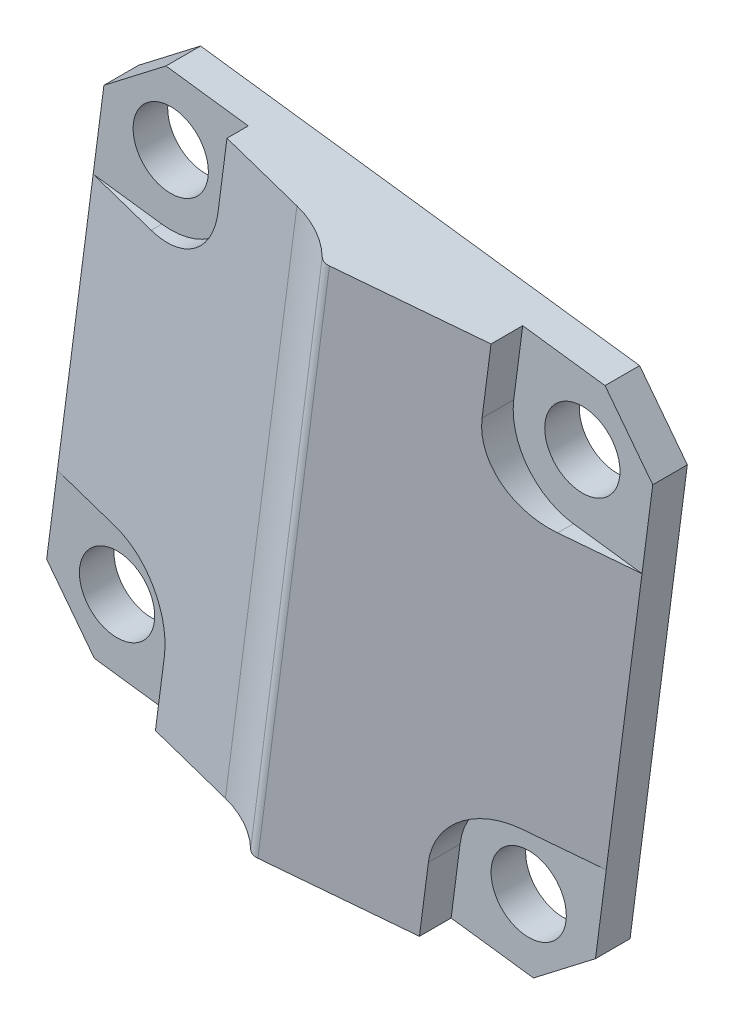
ISO-10303-21;
HEADER;
FILE_DESCRIPTION(('STEP AP214'),'2;1');
FILE_NAME('part.step','',(''),(''),'','','');
FILE_SCHEMA(('AUTOMOTIVE_DESIGN { 1 0 10303 214 1 1 1 1 }'));
ENDSEC;
DATA;
#1=APPLICATION_CONTEXT('core data for automotive mechanical design processes');
#2=APPLICATION_PROTOCOL_DEFINITION('international standard','automotive_design',2000,#1);
#3=PRODUCT_CONTEXT('',#1,'mechanical');
#4=PRODUCT('Part','Part','',(#3));
#5=PRODUCT_RELATED_PRODUCT_CATEGORY('part','',(#4));
#6=PRODUCT_DEFINITION_FORMATION('','',#4);
#7=PRODUCT_DEFINITION_CONTEXT('part definition',#1,'design');
#8=PRODUCT_DEFINITION('design','',#6,#7);
#9=PRODUCT_DEFINITION_SHAPE('','',#8);
#10=(LENGTH_UNIT() NAMED_UNIT(*) SI_UNIT(.MILLI.,.METRE.));
#11=(NAMED_UNIT(*) PLANE_ANGLE_UNIT() SI_UNIT($,.RADIAN.));
#12=(NAMED_UNIT(*) SI_UNIT($,.STERADIAN.) SOLID_ANGLE_UNIT());
#13=UNCERTAINTY_MEASURE_WITH_UNIT(LENGTH_MEASURE(1.E-05),#10,'distance_accuracy_value','');
#14=(GEOMETRIC_REPRESENTATION_CONTEXT(3) GLOBAL_UNCERTAINTY_ASSIGNED_CONTEXT((#13)) GLOBAL_UNIT_ASSIGNED_CONTEXT((#10,
#11,#12)) REPRESENTATION_CONTEXT('',''));
#15=CARTESIAN_POINT('',(0.,0.,0.));
#16=DIRECTION('',(0.,0.,1.));
#17=DIRECTION('',(1.,0.,0.));
#18=AXIS2_PLACEMENT_3D('',#15,#16,#17);
#19=CARTESIAN_POINT('',(-37.3767571490748,-111.329189903824,1.5875));
#20=DIRECTION('',(0.129314816705217,0.991603589233367,0.));
#21=DIRECTION('',(-0.991603589233367,0.129314816705217,0.));
#22=AXIS2_PLACEMENT_3D('',#19,#20,#21);
#23=PLANE('',#22);
#24=DIRECTION('',(0.991603589233367,-0.129314816705217,0.));
#25=VECTOR('',#24,1.);
#26=CARTESIAN_POINT('',(-37.3767571490748,-111.329189903824,0.));
#27=LINE('',#26,#25);
#28=CARTESIAN_POINT('',(-34.8580840324221,-111.657649538255,0.));
#29=VERTEX_POINT('',#28);
#30=CARTESIAN_POINT('',(-14.7086990992001,-114.285326613705,0.));
#31=VERTEX_POINT('',#30);
#32=EDGE_CURVE('E324',#29,#31,#27,.T.);
#33=ORIENTED_EDGE('',*,*,#32,.T.);
#34=DIRECTION('',(0.,0.,1.));
#35=VECTOR('',#34,1.);
#36=CARTESIAN_POINT('',(-14.7086990992001,-114.285326613705,1.5875));
#37=LINE('',#36,#35);
#38=CARTESIAN_POINT('',(-14.7086990992001,-114.285326613705,1.5875));
#39=VERTEX_POINT('',#38);
#40=EDGE_CURVE('E414',#31,#39,#37,.T.);
#41=ORIENTED_EDGE('',*,*,#40,.T.);
#42=DIRECTION('',(0.991603589233367,-0.129314816705217,0.));
#43=VECTOR('',#42,1.);
#44=CARTESIAN_POINT('',(-37.3767571490748,-111.329189903824,1.5875));
#45=LINE('',#44,#43);
#46=CARTESIAN_POINT('',(-18.4867087741792,-113.792637162058,1.5875));
#47=VERTEX_POINT('',#46);
#48=EDGE_CURVE('E283',#47,#39,#45,.T.);
#49=ORIENTED_EDGE('',*,*,#48,.F.);
#50=DIRECTION('',(0.,0.,-1.));
#51=VECTOR('',#50,1.);
#52=CARTESIAN_POINT('',(-18.4867087741792,-113.792637162058,1.5875));
#53=LINE('',#52,#51);
#54=CARTESIAN_POINT('',(-18.4867087741792,-113.792637162058,3.04165000000001));
#55=VERTEX_POINT('',#54);
#56=EDGE_CURVE('E292',#55,#47,#53,.T.);
#57=ORIENTED_EDGE('',*,*,#56,.F.);
#58=DIRECTION('',(-0.966583129481826,0.126051903781362,0.223221798564149));
#59=VECTOR('',#58,1.);
#60=CARTESIAN_POINT('',(-24.783391565811,-112.97148807598,4.4958));
#61=LINE('',#60,#59);
#62=CARTESIAN_POINT('',(-24.509062354858,-113.007263291012,4.43244667011057));
#63=VERTEX_POINT('',#62);
#64=EDGE_CURVE('E309',#55,#63,#61,.T.);
#65=ORIENTED_EDGE('',*,*,#64,.T.);
#66=CARTESIAN_POINT('',(-24.6215069034769,-112.992599420941,3.93726468901631));
#67=DIRECTION('',(0.129314816705217,0.991603589233367,0.));
#68=DIRECTION('',(-0.991603589233367,0.129314816705217,0.));
#69=AXIS2_PLACEMENT_3D('',#66,#67,#68);
#70=CIRCLE('',#69,0.508);
#71=CARTESIAN_POINT('',(-24.9698671790054,-112.947169830259,4.30420510750987));
#72=VERTEX_POINT('',#71);
#73=EDGE_CURVE('E348',#63,#72,#70,.F.);
#74=ORIENTED_EDGE('',*,*,#73,.T.);
#75=CARTESIAN_POINT('',(-27.931732961627,-112.560913532941,7.42404495764267));
#76=DIRECTION('',(0.129314816705217,0.991603589233367,0.));
#77=DIRECTION('',(-0.991603589233367,0.129314816705217,0.));
#78=AXIS2_PLACEMENT_3D('',#75,#76,#77);
#79=CIRCLE('',#78,4.31917162566616);
#80=CARTESIAN_POINT('',(-27.2800098672253,-112.645904605392,3.15517191458004));
#81=VERTEX_POINT('',#80);
#82=EDGE_CURVE('E307',#72,#81,#79,.T.);
#83=ORIENTED_EDGE('',*,*,#82,.T.);
#84=DIRECTION('',(-0.980055945526266,0.127808890904247,-0.152168429854696));
#85=VECTOR('',#84,1.);
#86=CARTESIAN_POINT('',(-37.3767571490748,-111.329189903824,1.5875));
#87=LINE('',#86,#85);
#88=CARTESIAN_POINT('',(-31.080074357443,-112.150338989902,2.56515473294608));
#89=VERTEX_POINT('',#88);
#90=EDGE_CURVE('E312',#81,#89,#87,.T.);
#91=ORIENTED_EDGE('',*,*,#90,.T.);
#92=DIRECTION('',(0.,0.,1.));
#93=VECTOR('',#92,1.);
#94=CARTESIAN_POINT('',(-31.080074357443,-112.150338989902,1.5875));
#95=LINE('',#94,#93);
#96=CARTESIAN_POINT('',(-31.080074357443,-112.150338989902,1.5875));
#97=VERTEX_POINT('',#96);
#98=EDGE_CURVE('E286',#97,#89,#95,.T.);
#99=ORIENTED_EDGE('',*,*,#98,.F.);
#100=DIRECTION('',(0.991603589233367,-0.129314816705217,0.));
#101=VECTOR('',#100,1.);
#102=CARTESIAN_POINT('',(-37.3767571490748,-111.329189903824,1.5875));
#103=LINE('',#102,#101);
#104=CARTESIAN_POINT('',(-34.8580840324221,-111.657649538255,1.5875));
#105=VERTEX_POINT('',#104);
#106=EDGE_CURVE('E280',#105,#97,#103,.T.);
#107=ORIENTED_EDGE('',*,*,#106,.F.);
#108=DIRECTION('',(0.,0.,-1.));
#109=VECTOR('',#108,1.);
#110=CARTESIAN_POINT('',(-34.8580840324221,-111.657649538255,1.5875));
#111=LINE('',#110,#109);
#112=EDGE_CURVE('E411',#105,#29,#111,.T.);
#113=ORIENTED_EDGE('',*,*,#112,.T.);
#114=EDGE_LOOP('',(#33,#41,#49,#57,#65,#74,#83,#91,#99,#107,#113));
#115=FACE_BOUND('',#114,.T.);
#116=ADVANCED_FACE('F35',(#115),#23,.F.);
#117=CARTESIAN_POINT('',(-34.0921608047624,-86.142458737296,1.5875));
#118=DIRECTION('',(-0.129314816705216,-0.991603589233367,0.));
#119=DIRECTION('',(0.991603589233367,-0.129314816705216,0.));
#120=AXIS2_PLACEMENT_3D('',#117,#118,#119);
#121=PLANE('',#120);
#122=DIRECTION('',(-0.991603589233367,0.129314816705216,0.));
#123=VECTOR('',#122,1.);
#124=CARTESIAN_POINT('',(-34.0921608047624,-86.142458737296,1.5875));
#125=LINE('',#124,#123);
#126=CARTESIAN_POINT('',(-11.4241027548876,-89.0985954471772,1.5875));
#127=VERTEX_POINT('',#126);
#128=CARTESIAN_POINT('',(-15.2021124298667,-88.6059059955303,1.5875));
#129=VERTEX_POINT('',#128);
#130=EDGE_CURVE('E272',#127,#129,#125,.T.);
#131=ORIENTED_EDGE('',*,*,#130,.F.);
#132=DIRECTION('',(0.,0.,-1.));
#133=VECTOR('',#132,1.);
#134=CARTESIAN_POINT('',(-11.4241027548876,-89.0985954471772,1.5875));
#135=LINE('',#134,#133);
#136=CARTESIAN_POINT('',(-11.4241027548876,-89.0985954471772,0.));
#137=VERTEX_POINT('',#136);
#138=EDGE_CURVE('E393',#127,#137,#135,.T.);
#139=ORIENTED_EDGE('',*,*,#138,.T.);
#140=DIRECTION('',(-0.991603589233367,0.129314816705216,0.));
#141=VECTOR('',#140,1.);
#142=CARTESIAN_POINT('',(-34.0921608047624,-86.142458737296,0.));
#143=LINE('',#142,#141);
#144=CARTESIAN_POINT('',(-31.5734876881096,-86.4709183717272,0.));
#145=VERTEX_POINT('',#144);
#146=EDGE_CURVE('E336',#137,#145,#143,.T.);
#147=ORIENTED_EDGE('',*,*,#146,.T.);
#148=DIRECTION('',(0.,0.,1.));
#149=VECTOR('',#148,1.);
#150=CARTESIAN_POINT('',(-31.5734876881096,-86.4709183717272,1.5875));
#151=LINE('',#150,#149);
#152=CARTESIAN_POINT('',(-31.5734876881096,-86.4709183717272,1.5875));
#153=VERTEX_POINT('',#152);
#154=EDGE_CURVE('E391',#145,#153,#151,.T.);
#155=ORIENTED_EDGE('',*,*,#154,.T.);
#156=DIRECTION('',(-0.991603589233367,0.129314816705216,0.));
#157=VECTOR('',#156,1.);
#158=CARTESIAN_POINT('',(-34.0921608047624,-86.142458737296,1.5875));
#159=LINE('',#158,#157);
#160=CARTESIAN_POINT('',(-27.7954780131305,-86.9636078233741,1.5875));
#161=VERTEX_POINT('',#160);
#162=EDGE_CURVE('E275',#161,#153,#159,.T.);
#163=ORIENTED_EDGE('',*,*,#162,.F.);
#164=DIRECTION('',(0.,0.,-1.));
#165=VECTOR('',#164,1.);
#166=CARTESIAN_POINT('',(-27.7954780131305,-86.9636078233741,1.5875));
#167=LINE('',#166,#165);
#168=CARTESIAN_POINT('',(-27.7954780131305,-86.9636078233741,2.56515473294608));
#169=VERTEX_POINT('',#168);
#170=EDGE_CURVE('E288',#169,#161,#167,.T.);
#171=ORIENTED_EDGE('',*,*,#170,.F.);
#172=DIRECTION('',(0.980055945526266,-0.127808890904246,0.152168429854696));
#173=VECTOR('',#172,1.);
#174=CARTESIAN_POINT('',(-34.0921608047623,-86.142458737296,1.5875));
#175=LINE('',#174,#173);
#176=CARTESIAN_POINT('',(-23.9954135229128,-87.4591734388641,3.15517191458004));
#177=VERTEX_POINT('',#176);
#178=EDGE_CURVE('E306',#169,#177,#175,.T.);
#179=ORIENTED_EDGE('',*,*,#178,.T.);
#180=CARTESIAN_POINT('',(-24.6471366173145,-87.3741823664132,7.42404495764267));
#181=DIRECTION('',(-0.129314816705216,-0.991603589233367,0.));
#182=DIRECTION('',(0.991603589233367,-0.129314816705216,0.));
#183=AXIS2_PLACEMENT_3D('',#180,#181,#182);
#184=CIRCLE('',#183,4.31917162566616);
#185=CARTESIAN_POINT('',(-21.6852708346929,-87.7604386637319,4.30420510750987));
#186=VERTEX_POINT('',#185);
#187=EDGE_CURVE('E314',#177,#186,#184,.T.);
#188=ORIENTED_EDGE('',*,*,#187,.T.);
#189=CARTESIAN_POINT('',(-21.3369105591644,-87.8058682544135,3.93726468901631));
#190=DIRECTION('',(-0.129314816705216,-0.991603589233367,0.));
#191=DIRECTION('',(0.991603589233367,-0.129314816705216,0.));
#192=AXIS2_PLACEMENT_3D('',#189,#190,#191);
#193=CIRCLE('',#192,0.508);
#194=CARTESIAN_POINT('',(-21.2244660105455,-87.8205321244842,4.43244667011057));
#195=VERTEX_POINT('',#194);
#196=EDGE_CURVE('E343',#186,#195,#193,.F.);
#197=ORIENTED_EDGE('',*,*,#196,.T.);
#198=DIRECTION('',(0.966583129481826,-0.126051903781361,-0.223221798564149));
#199=VECTOR('',#198,1.);
#200=CARTESIAN_POINT('',(-21.4987952214985,-87.7847569094523,4.4958));
#201=LINE('',#200,#199);
#202=CARTESIAN_POINT('',(-15.2021124298667,-88.6059059955304,3.04165));
#203=VERTEX_POINT('',#202);
#204=EDGE_CURVE('E317',#195,#203,#201,.T.);
#205=ORIENTED_EDGE('',*,*,#204,.T.);
#206=DIRECTION('',(0.,0.,1.));
#207=VECTOR('',#206,1.);
#208=CARTESIAN_POINT('',(-15.2021124298667,-88.6059059955303,1.5875));
#209=LINE('',#208,#207);
#210=EDGE_CURVE('E290',#129,#203,#209,.T.);
#211=ORIENTED_EDGE('',*,*,#210,.F.);
#212=EDGE_LOOP('',(#131,#139,#147,#155,#163,#171,#179,#188,#197,#205,#211));
#213=FACE_BOUND('',#212,.T.);
#214=ADVANCED_FACE('F443',(#213),#121,.F.);
#215=CARTESIAN_POINT('',(-28.0894487395674,-138.322783799352,4.4958));
#216=DIRECTION('',(0.221347536651338,-0.0288658859659317,0.97476767931943));
#217=DIRECTION('',(0.975174040689062,0.,-0.221439812062256));
#218=AXIS2_PLACEMENT_3D('',#215,#216,#217);
#219=PLANE('',#218);
#220=ORIENTED_EDGE('',*,*,#64,.F.);
#221=DIRECTION('',(0.129314816705219,0.991603589233367,0.));
#222=VECTOR('',#221,1.);
#223=CARTESIAN_POINT('',(-21.7927659479357,-139.14393288543,3.04165000000002));
#224=LINE('',#223,#222);
#225=CARTESIAN_POINT('',(-18.0761342311401,-110.644295766242,3.04165000000001));
#226=VERTEX_POINT('',#225);
#227=EDGE_CURVE('E388',#55,#226,#224,.T.);
#228=ORIENTED_EDGE('',*,*,#227,.T.);
#229=CARTESIAN_POINT('',(-14.9277928353242,-111.054870309281,2.31457500000001));
#230=DIRECTION('',(0.221347536651338,-0.0288658859659317,0.97476767931943));
#231=DIRECTION('',(-0.966583129481826,0.126051903781361,0.223221798564149));
#232=AXIS2_PLACEMENT_3D('',#229,#230,#231);
#233=ELLIPSE('',#232,3.2571863710302,3.17499999999998);
#234=CARTESIAN_POINT('',(-14.5172182922851,-107.906528913465,2.31457500000001));
#235=VERTEX_POINT('',#234);
#236=EDGE_CURVE('E382',#226,#235,#233,.F.);
#237=ORIENTED_EDGE('',*,*,#236,.T.);
#238=DIRECTION('',(0.966583129481826,-0.12605190378136,-0.22322179856415));
#239=VECTOR('',#238,1.);
#240=CARTESIAN_POINT('',(-23.962242479733,-106.674805284348,4.49580000000001));
#241=LINE('',#240,#239);
#242=CARTESIAN_POINT('',(-11.3688768964692,-108.317103456504,1.5875));
#243=VERTEX_POINT('',#242);
#244=EDGE_CURVE('E385',#235,#243,#241,.T.);
#245=ORIENTED_EDGE('',*,*,#244,.T.);
#246=DIRECTION('',(0.129314816705216,0.991603589233367,0.));
#247=VECTOR('',#246,1.);
#248=CARTESIAN_POINT('',(-12.1900259825473,-114.613786248136,1.5875));
#249=LINE('',#248,#247);
#250=CARTESIAN_POINT('',(-9.72657872431295,-95.7237378732403,1.5875));
#251=VERTEX_POINT('',#250);
#252=EDGE_CURVE('E328',#243,#251,#249,.T.);
#253=ORIENTED_EDGE('',*,*,#252,.T.);
#254=DIRECTION('',(-0.966583129481826,0.126051903781364,0.223221798564149));
#255=VECTOR('',#254,1.);
#256=CARTESIAN_POINT('',(-22.3199443075765,-94.0814397010841,4.49579999999997));
#257=LINE('',#256,#255);
#258=CARTESIAN_POINT('',(-12.8749201201289,-95.3131633302013,2.31457500000001));
#259=VERTEX_POINT('',#258);
#260=EDGE_CURVE('E379',#251,#259,#257,.T.);
#261=ORIENTED_EDGE('',*,*,#260,.T.);
#262=CARTESIAN_POINT('',(-12.4643455770898,-92.1648219343854,2.31457500000001));
#263=DIRECTION('',(0.221347536651338,-0.0288658859659317,0.97476767931943));
#264=DIRECTION('',(-0.966583129481826,0.126051903781361,0.223221798564149));
#265=AXIS2_PLACEMENT_3D('',#262,#263,#264);
#266=ELLIPSE('',#265,3.2571863710302,3.17499999999998);
#267=CARTESIAN_POINT('',(-15.6126869729057,-91.7542473913463,3.04165000000001));
#268=VERTEX_POINT('',#267);
#269=EDGE_CURVE('E373',#259,#268,#266,.F.);
#270=ORIENTED_EDGE('',*,*,#269,.T.);
#271=DIRECTION('',(0.129314816705218,0.991603589233367,0.));
#272=VECTOR('',#271,1.);
#273=CARTESIAN_POINT('',(-21.7927659479357,-139.14393288543,3.04165000000003));
#274=LINE('',#273,#272);
#275=EDGE_CURVE('E376',#268,#203,#274,.T.);
#276=ORIENTED_EDGE('',*,*,#275,.T.);
#277=ORIENTED_EDGE('',*,*,#204,.F.);
#278=DIRECTION('',(0.129314816705216,0.991603589233367,0.));
#279=VECTOR('',#278,1.);
#280=CARTESIAN_POINT('',(-27.8151195286144,-138.358559014384,4.43244667011057));
#281=LINE('',#280,#279);
#282=EDGE_CURVE('E345',#195,#63,#281,.F.);
#283=ORIENTED_EDGE('',*,*,#282,.T.);
#284=EDGE_LOOP('',(#220,#228,#237,#245,#253,#261,#270,#276,#277,#283));
#285=FACE_BOUND('',#284,.T.);
#286=ADVANCED_FACE('F472',(#285),#219,.T.);
#287=CARTESIAN_POINT('',(-40.6828143228312,-136.680485627195,1.5875));
#288=DIRECTION('',(-0.150890761211922,0.0196776326149805,0.988354576533926));
#289=DIRECTION('',(0.988545982126194,0.,0.15091998284574));
#290=AXIS2_PLACEMENT_3D('',#287,#288,#289);
#291=PLANE('',#290);
#292=ORIENTED_EDGE('',*,*,#178,.F.);
#293=DIRECTION('',(-0.129314816705218,-0.991603589233367,0.));
#294=VECTOR('',#293,1.);
#295=CARTESIAN_POINT('',(-34.3861315311995,-137.501634713274,2.56515473294607));
#296=LINE('',#295,#294);
#297=CARTESIAN_POINT('',(-28.2060525561696,-90.11194921919,2.56515473294607));
#298=VERTEX_POINT('',#297);
#299=EDGE_CURVE('E370',#169,#298,#296,.T.);
#300=ORIENTED_EDGE('',*,*,#299,.T.);
#301=CARTESIAN_POINT('',(-31.3543939519855,-89.701374676151,2.07632736647303));
#302=DIRECTION('',(-0.150890761211922,0.0196776326149805,0.988354576533926));
#303=DIRECTION('',(0.980055945526266,-0.127808890904246,0.152168429854696));
#304=AXIS2_PLACEMENT_3D('',#301,#302,#303);
#305=ELLIPSE('',#304,3.2124098733214,3.17499999999998);
#306=CARTESIAN_POINT('',(-31.7649684950245,-92.8497160719669,2.07632736647303));
#307=VERTEX_POINT('',#306);
#308=EDGE_CURVE('E367',#298,#307,#305,.F.);
#309=ORIENTED_EDGE('',*,*,#308,.T.);
#310=DIRECTION('',(-0.980055945526266,0.127808890904245,-0.152168429854696));
#311=VECTOR('',#310,1.);
#312=CARTESIAN_POINT('',(-34.9133098908405,-92.4391415289278,1.58749999999999));
#313=LINE('',#312,#311);
#314=CARTESIAN_POINT('',(-34.9133098908404,-92.4391415289278,1.5875));
#315=VERTEX_POINT('',#314);
#316=EDGE_CURVE('E223',#307,#315,#313,.T.);
#317=ORIENTED_EDGE('',*,*,#316,.T.);
#318=DIRECTION('',(-0.129314816705216,-0.991603589233367,0.));
#319=VECTOR('',#318,1.);
#320=CARTESIAN_POINT('',(-37.3767571490748,-111.329189903824,1.5875));
#321=LINE('',#320,#319);
#322=CARTESIAN_POINT('',(-36.5556080629967,-105.032507112192,1.5875));
#323=VERTEX_POINT('',#322);
#324=EDGE_CURVE('E327',#315,#323,#321,.T.);
#325=ORIENTED_EDGE('',*,*,#324,.T.);
#326=DIRECTION('',(0.980055945526266,-0.127808890904247,0.152168429854696));
#327=VECTOR('',#326,1.);
#328=CARTESIAN_POINT('',(-36.5556080629967,-105.032507112192,1.5875));
#329=LINE('',#328,#327);
#330=CARTESIAN_POINT('',(-33.4072666671808,-105.443081655231,2.07632736647303));
#331=VERTEX_POINT('',#330);
#332=EDGE_CURVE('E364',#323,#331,#329,.T.);
#333=ORIENTED_EDGE('',*,*,#332,.T.);
#334=CARTESIAN_POINT('',(-33.8178412102199,-108.591423051047,2.07632736647303));
#335=DIRECTION('',(-0.150890761211922,0.0196776326149805,0.988354576533926));
#336=DIRECTION('',(0.980055945526266,-0.127808890904246,0.152168429854696));
#337=AXIS2_PLACEMENT_3D('',#334,#335,#336);
#338=ELLIPSE('',#337,3.2124098733214,3.17499999999998);
#339=CARTESIAN_POINT('',(-30.6694998144039,-109.001997594086,2.56515473294607));
#340=VERTEX_POINT('',#339);
#341=EDGE_CURVE('E350',#331,#340,#338,.F.);
#342=ORIENTED_EDGE('',*,*,#341,.T.);
#343=DIRECTION('',(-0.129314816705215,-0.991603589233367,0.));
#344=VECTOR('',#343,1.);
#345=CARTESIAN_POINT('',(-34.3861315311993,-137.501634713274,2.56515473294608));
#346=LINE('',#345,#344);
#347=EDGE_CURVE('E361',#340,#89,#346,.T.);
#348=ORIENTED_EDGE('',*,*,#347,.T.);
#349=ORIENTED_EDGE('',*,*,#90,.F.);
#350=DIRECTION('',(0.129314816705216,0.991603589233367,0.));
#351=VECTOR('',#350,1.);
#352=CARTESIAN_POINT('',(-30.5860670409817,-137.997200328764,3.15517191458004));
#353=LINE('',#352,#351);
#354=EDGE_CURVE('E310',#81,#177,#353,.T.);
#355=ORIENTED_EDGE('',*,*,#354,.T.);
#356=EDGE_LOOP('',(#292,#300,#309,#317,#325,#333,#342,#348,#349,#355));
#357=FACE_BOUND('',#356,.T.);
#358=ADVANCED_FACE('F487',(#357),#291,.T.);
#359=CARTESIAN_POINT('',(-14.9277928353242,-111.054870309281,0.));
#360=DIRECTION('',(0.,0.,-1.));
#361=DIRECTION('',(-1.,0.,0.));
#362=AXIS2_PLACEMENT_3D('',#359,#360,#361);
#363=CYLINDRICAL_SURFACE('',#362,1.72719999999999);
#364=CARTESIAN_POINT('',(-14.9277928353242,-111.054870309281,0.));
#365=DIRECTION('',(0.,0.,-1.));
#366=DIRECTION('',(-1.,0.,0.));
#367=AXIS2_PLACEMENT_3D('',#364,#365,#366);
#368=CIRCLE('',#367,1.72719999999999);
#369=CARTESIAN_POINT('',(-16.6549928353242,-111.054870309281,0.));
#370=VERTEX_POINT('',#369);
#371=EDGE_CURVE('E303',#370,#370,#368,.T.);
#372=ORIENTED_EDGE('',*,*,#371,.T.);
#373=EDGE_LOOP('',(#372));
#374=FACE_BOUND('',#373,.T.);
#375=CARTESIAN_POINT('',(-14.9277928353242,-111.054870309281,1.5875));
#376=DIRECTION('',(0.,0.,1.));
#377=DIRECTION('',(1.,0.,0.));
#378=AXIS2_PLACEMENT_3D('',#375,#376,#377);
#379=CIRCLE('',#378,1.72719999999999);
#380=CARTESIAN_POINT('',(-13.2005928353242,-111.054870309281,1.5875));
#381=VERTEX_POINT('',#380);
#382=EDGE_CURVE('E282',#381,#381,#379,.F.);
#383=ORIENTED_EDGE('',*,*,#382,.F.);
#384=EDGE_LOOP('',(#383));
#385=FACE_BOUND('',#384,.T.);
#386=ADVANCED_FACE('F759',(#374,#385),#363,.F.);
#387=CARTESIAN_POINT('',(-33.8178412102199,-108.591423051047,0.));
#388=DIRECTION('',(0.,0.,-1.));
#389=DIRECTION('',(-1.,0.,0.));
#390=AXIS2_PLACEMENT_3D('',#387,#388,#389);
#391=CYLINDRICAL_SURFACE('',#390,1.72719999999999);
#392=CARTESIAN_POINT('',(-33.8178412102199,-108.591423051047,0.));
#393=DIRECTION('',(0.,0.,-1.));
#394=DIRECTION('',(-1.,0.,0.));
#395=AXIS2_PLACEMENT_3D('',#392,#393,#394);
#396=CIRCLE('',#395,1.72719999999998);
#397=CARTESIAN_POINT('',(-35.5450412102198,-108.591423051047,0.));
#398=VERTEX_POINT('',#397);
#399=EDGE_CURVE('E300',#398,#398,#396,.T.);
#400=ORIENTED_EDGE('',*,*,#399,.T.);
#401=EDGE_LOOP('',(#400));
#402=FACE_BOUND('',#401,.T.);
#403=CARTESIAN_POINT('',(-33.8178412102199,-108.591423051047,1.5875));
#404=DIRECTION('',(0.,0.,1.));
#405=DIRECTION('',(1.,0.,0.));
#406=AXIS2_PLACEMENT_3D('',#403,#404,#405);
#407=CIRCLE('',#406,1.72719999999999);
#408=CARTESIAN_POINT('',(-32.0906412102199,-108.591423051047,1.5875));
#409=VERTEX_POINT('',#408);
#410=EDGE_CURVE('E277',#409,#409,#407,.F.);
#411=ORIENTED_EDGE('',*,*,#410,.F.);
#412=EDGE_LOOP('',(#411));
#413=FACE_BOUND('',#412,.T.);
#414=ADVANCED_FACE('F749',(#402,#413),#391,.F.);
#415=CARTESIAN_POINT('',(-31.3543939519855,-89.701374676151,0.));
#416=DIRECTION('',(0.,0.,-1.));
#417=DIRECTION('',(-1.,0.,0.));
#418=AXIS2_PLACEMENT_3D('',#415,#416,#417);
#419=CYLINDRICAL_SURFACE('',#418,1.72719999999999);
#420=CARTESIAN_POINT('',(-31.3543939519855,-89.701374676151,0.));
#421=DIRECTION('',(0.,0.,-1.));
#422=DIRECTION('',(-1.,0.,0.));
#423=AXIS2_PLACEMENT_3D('',#420,#421,#422);
#424=CIRCLE('',#423,1.72719999999999);
#425=CARTESIAN_POINT('',(-33.0815939519855,-89.701374676151,0.));
#426=VERTEX_POINT('',#425);
#427=EDGE_CURVE('E297',#426,#426,#424,.T.);
#428=ORIENTED_EDGE('',*,*,#427,.T.);
#429=EDGE_LOOP('',(#428));
#430=FACE_BOUND('',#429,.T.);
#431=CARTESIAN_POINT('',(-31.3543939519855,-89.701374676151,1.5875));
#432=DIRECTION('',(0.,0.,1.));
#433=DIRECTION('',(1.,0.,0.));
#434=AXIS2_PLACEMENT_3D('',#431,#432,#433);
#435=CIRCLE('',#434,1.72719999999999);
#436=CARTESIAN_POINT('',(-29.6271939519855,-89.701374676151,1.5875));
#437=VERTEX_POINT('',#436);
#438=EDGE_CURVE('E274',#437,#437,#435,.F.);
#439=ORIENTED_EDGE('',*,*,#438,.F.);
#440=EDGE_LOOP('',(#439));
#441=FACE_BOUND('',#440,.T.);
#442=ADVANCED_FACE('F738',(#430,#441),#419,.F.);
#443=CARTESIAN_POINT('',(-12.4643455770898,-92.1648219343853,0.));
#444=DIRECTION('',(0.,0.,-1.));
#445=DIRECTION('',(-1.,0.,0.));
#446=AXIS2_PLACEMENT_3D('',#443,#444,#445);
#447=CYLINDRICAL_SURFACE('',#446,1.72719999999999);
#448=CARTESIAN_POINT('',(-12.4643455770898,-92.1648219343853,0.));
#449=DIRECTION('',(0.,0.,-1.));
#450=DIRECTION('',(-1.,0.,0.));
#451=AXIS2_PLACEMENT_3D('',#448,#449,#450);
#452=CIRCLE('',#451,1.72719999999999);
#453=CARTESIAN_POINT('',(-14.1915455770898,-92.1648219343853,0.));
#454=VERTEX_POINT('',#453);
#455=EDGE_CURVE('E294',#454,#454,#452,.T.);
#456=ORIENTED_EDGE('',*,*,#455,.T.);
#457=EDGE_LOOP('',(#456));
#458=FACE_BOUND('',#457,.T.);
#459=CARTESIAN_POINT('',(-12.4643455770898,-92.1648219343853,1.5875));
#460=DIRECTION('',(0.,0.,1.));
#461=DIRECTION('',(1.,0.,0.));
#462=AXIS2_PLACEMENT_3D('',#459,#460,#461);
#463=CIRCLE('',#462,1.72719999999999);
#464=CARTESIAN_POINT('',(-10.7371455770898,-92.1648219343853,1.5875));
#465=VERTEX_POINT('',#464);
#466=EDGE_CURVE('E262',#465,#465,#463,.F.);
#467=ORIENTED_EDGE('',*,*,#466,.F.);
#468=EDGE_LOOP('',(#467));
#469=FACE_BOUND('',#468,.T.);
#470=ADVANCED_FACE('F643',(#458,#469),#447,.F.);
#471=CARTESIAN_POINT('',(-12.1900259825473,-114.613786248136,1.5875));
#472=DIRECTION('',(-0.991603589233367,0.129314816705216,0.));
#473=DIRECTION('',(-0.129314816705216,-0.991603589233367,0.));
#474=AXIS2_PLACEMENT_3D('',#471,#472,#473);
#475=PLANE('',#474);
#476=DIRECTION('',(0.129314816705216,0.991603589233367,0.));
#477=VECTOR('',#476,1.);
#478=CARTESIAN_POINT('',(-12.1900259825473,-114.613786248136,0.));
#479=LINE('',#478,#477);
#480=CARTESIAN_POINT('',(-11.8615663481161,-112.095113131483,0.));
#481=VERTEX_POINT('',#480);
#482=CARTESIAN_POINT('',(-9.23388927266609,-91.9457281982612,0.));
#483=VERTEX_POINT('',#482);
#484=EDGE_CURVE('E333',#481,#483,#479,.T.);
#485=ORIENTED_EDGE('',*,*,#484,.T.);
#486=DIRECTION('',(0.,0.,1.));
#487=VECTOR('',#486,1.);
#488=CARTESIAN_POINT('',(-9.23388927266609,-91.9457281982612,1.5875));
#489=LINE('',#488,#487);
#490=CARTESIAN_POINT('',(-9.23388927266603,-91.9457281982612,1.5875));
#491=VERTEX_POINT('',#490);
#492=EDGE_CURVE('E407',#483,#491,#489,.T.);
#493=ORIENTED_EDGE('',*,*,#492,.T.);
#494=DIRECTION('',(-0.129314816705216,-0.991603589233367,0.));
#495=VECTOR('',#494,1.);
#496=CARTESIAN_POINT('',(-15.4960831563037,-139.965081971508,1.5875));
#497=LINE('',#496,#495);
#498=EDGE_CURVE('E270',#491,#251,#497,.T.);
#499=ORIENTED_EDGE('',*,*,#498,.T.);
#500=ORIENTED_EDGE('',*,*,#252,.F.);
#501=CARTESIAN_POINT('',(-11.8615663481161,-112.095113131483,1.5875));
#502=VERTEX_POINT('',#501);
#503=EDGE_CURVE('E325',#502,#243,#249,.T.);
#504=ORIENTED_EDGE('',*,*,#503,.F.);
#505=DIRECTION('',(0.,0.,-1.));
#506=VECTOR('',#505,1.);
#507=CARTESIAN_POINT('',(-11.8615663481161,-112.095113131483,1.5875));
#508=LINE('',#507,#506);
#509=EDGE_CURVE('E404',#502,#481,#508,.T.);
#510=ORIENTED_EDGE('',*,*,#509,.T.);
#511=EDGE_LOOP('',(#485,#493,#499,#500,#504,#510));
#512=FACE_BOUND('',#511,.T.);
#513=ADVANCED_FACE('F453',(#512),#475,.F.);
#514=CARTESIAN_POINT('',(-37.3767571490748,-111.329189903824,1.5875));
#515=DIRECTION('',(0.991603589233367,-0.129314816705216,0.));
#516=DIRECTION('',(0.129314816705216,0.991603589233367,0.));
#517=AXIS2_PLACEMENT_3D('',#514,#515,#516);
#518=PLANE('',#517);
#519=DIRECTION('',(-0.129314816705216,-0.991603589233367,0.));
#520=VECTOR('',#519,1.);
#521=CARTESIAN_POINT('',(-37.3767571490748,-111.329189903824,0.));
#522=LINE('',#521,#520);
#523=CARTESIAN_POINT('',(-34.4206204391936,-88.6611318539487,0.));
#524=VERTEX_POINT('',#523);
#525=CARTESIAN_POINT('',(-37.0482975146436,-108.810516787171,0.));
#526=VERTEX_POINT('',#525);
#527=EDGE_CURVE('E339',#524,#526,#522,.T.);
#528=ORIENTED_EDGE('',*,*,#527,.T.);
#529=DIRECTION('',(0.,0.,1.));
#530=VECTOR('',#529,1.);
#531=CARTESIAN_POINT('',(-37.0482975146436,-108.810516787171,1.5875));
#532=LINE('',#531,#530);
#533=CARTESIAN_POINT('',(-37.0482975146436,-108.810516787171,1.5875));
#534=VERTEX_POINT('',#533);
#535=EDGE_CURVE('E56',#526,#534,#532,.T.);
#536=ORIENTED_EDGE('',*,*,#535,.T.);
#537=DIRECTION('',(0.129314816705216,0.991603589233367,0.));
#538=VECTOR('',#537,1.);
#539=CARTESIAN_POINT('',(-40.6828143228312,-136.680485627195,1.5875));
#540=LINE('',#539,#538);
#541=EDGE_CURVE('E278',#534,#323,#540,.T.);
#542=ORIENTED_EDGE('',*,*,#541,.T.);
#543=ORIENTED_EDGE('',*,*,#324,.F.);
#544=CARTESIAN_POINT('',(-34.4206204391936,-88.6611318539487,1.5875));
#545=VERTEX_POINT('',#544);
#546=EDGE_CURVE('E207',#545,#315,#321,.T.);
#547=ORIENTED_EDGE('',*,*,#546,.F.);
#548=DIRECTION('',(0.,0.,-1.));
#549=VECTOR('',#548,1.);
#550=CARTESIAN_POINT('',(-34.4206204391936,-88.6611318539487,1.5875));
#551=LINE('',#550,#549);
#552=EDGE_CURVE('E418',#545,#524,#551,.T.);
#553=ORIENTED_EDGE('',*,*,#552,.T.);
#554=EDGE_LOOP('',(#528,#536,#542,#543,#547,#553));
#555=FACE_BOUND('',#554,.T.);
#556=ADVANCED_FACE('F436',(#555),#518,.F.);
#557=CARTESIAN_POINT('',(0.,0.,0.));
#558=DIRECTION('',(0.,0.,1.));
#559=DIRECTION('',(1.,0.,0.));
#560=AXIS2_PLACEMENT_3D('',#557,#558,#559);
#561=PLANE('',#560);
#562=ORIENTED_EDGE('',*,*,#455,.F.);
#563=EDGE_LOOP('',(#562));
#564=FACE_BOUND('',#563,.T.);
#565=ORIENTED_EDGE('',*,*,#427,.F.);
#566=EDGE_LOOP('',(#565));
#567=FACE_BOUND('',#566,.T.);
#568=ORIENTED_EDGE('',*,*,#399,.F.);
#569=EDGE_LOOP('',(#568));
#570=FACE_BOUND('',#569,.T.);
#571=ORIENTED_EDGE('',*,*,#371,.F.);
#572=EDGE_LOOP('',(#571));
#573=FACE_BOUND('',#572,.T.);
#574=ORIENTED_EDGE('',*,*,#146,.F.);
#575=DIRECTION('',(-0.609730238395681,0.792609005995987,0.));
#576=VECTOR('',#575,1.);
#577=CARTESIAN_POINT('',(-11.4241027548876,-89.0985954471772,0.));
#578=LINE('',#577,#576);
#579=EDGE_CURVE('E402',#137,#483,#578,.F.);
#580=ORIENTED_EDGE('',*,*,#579,.T.);
#581=ORIENTED_EDGE('',*,*,#484,.F.);
#582=DIRECTION('',(0.792609005995989,0.609730238395679,0.));
#583=VECTOR('',#582,1.);
#584=CARTESIAN_POINT('',(-11.8615663481161,-112.095113131483,0.));
#585=LINE('',#584,#583);
#586=EDGE_CURVE('E400',#481,#31,#585,.F.);
#587=ORIENTED_EDGE('',*,*,#586,.T.);
#588=ORIENTED_EDGE('',*,*,#32,.F.);
#589=DIRECTION('',(0.60973023839568,-0.792609005995987,0.));
#590=VECTOR('',#589,1.);
#591=CARTESIAN_POINT('',(-34.8580840324221,-111.657649538255,0.));
#592=LINE('',#591,#590);
#593=EDGE_CURVE('E398',#29,#526,#592,.F.);
#594=ORIENTED_EDGE('',*,*,#593,.T.);
#595=ORIENTED_EDGE('',*,*,#527,.F.);
#596=DIRECTION('',(-0.79260900599599,-0.609730238395677,0.));
#597=VECTOR('',#596,1.);
#598=CARTESIAN_POINT('',(-34.4206204391936,-88.6611318539487,0.));
#599=LINE('',#598,#597);
#600=EDGE_CURVE('E396',#524,#145,#599,.F.);
#601=ORIENTED_EDGE('',*,*,#600,.T.);
#602=EDGE_LOOP('',(#574,#580,#581,#587,#588,#594,#595,#601));
#603=FACE_BOUND('',#602,.T.);
#604=ADVANCED_FACE('F435',(#564,#567,#570,#573,#603),#561,.F.);
#605=CARTESIAN_POINT('',(-31.2377901353834,-137.912209256313,7.42404495764267));
#606=DIRECTION('',(0.129314816705216,0.991603589233367,0.));
#607=DIRECTION('',(-0.991603589233367,0.129314816705216,0.));
#608=AXIS2_PLACEMENT_3D('',#605,#606,#607);
#609=CYLINDRICAL_SURFACE('',#608,4.31917162566616);
#610=ORIENTED_EDGE('',*,*,#82,.F.);
#611=DIRECTION('',(0.129314816705216,0.991603589233367,0.));
#612=VECTOR('',#611,1.);
#613=CARTESIAN_POINT('',(-28.2759243527618,-138.298465553631,4.30420510750987));
#614=LINE('',#613,#612);
#615=EDGE_CURVE('E330',#72,#186,#614,.T.);
#616=ORIENTED_EDGE('',*,*,#615,.T.);
#617=ORIENTED_EDGE('',*,*,#187,.F.);
#618=ORIENTED_EDGE('',*,*,#354,.F.);
#619=EDGE_LOOP('',(#610,#616,#617,#618));
#620=FACE_BOUND('',#619,.T.);
#621=ADVANCED_FACE('F482',(#620),#609,.F.);
#622=CARTESIAN_POINT('',(-27.9275640772333,-138.343895144313,3.93726468901631));
#623=DIRECTION('',(0.129314816705216,0.991603589233367,0.));
#624=DIRECTION('',(-0.991603589233367,0.129314816705216,0.));
#625=AXIS2_PLACEMENT_3D('',#622,#623,#624);
#626=CYLINDRICAL_SURFACE('',#625,0.508);
#627=ORIENTED_EDGE('',*,*,#73,.F.);
#628=ORIENTED_EDGE('',*,*,#282,.F.);
#629=ORIENTED_EDGE('',*,*,#196,.F.);
#630=ORIENTED_EDGE('',*,*,#615,.F.);
#631=EDGE_LOOP('',(#627,#628,#629,#630));
#632=FACE_BOUND('',#631,.T.);
#633=ADVANCED_FACE('F478',(#632),#626,.T.);
#634=CARTESIAN_POINT('',(-15.6126869729057,-91.7542473913463,-16.3901470670248));
#635=DIRECTION('',(0.991603589233367,-0.129314816705218,0.));
#636=DIRECTION('',(0.129314816705218,0.991603589233367,0.));
#637=AXIS2_PLACEMENT_3D('',#634,#635,#636);
#638=PLANE('',#637);
#639=ORIENTED_EDGE('',*,*,#210,.T.);
#640=ORIENTED_EDGE('',*,*,#275,.F.);
#641=DIRECTION('',(0.,0.,1.));
#642=VECTOR('',#641,1.);
#643=CARTESIAN_POINT('',(-15.6126869729057,-91.7542473913463,-16.3901470670248));
#644=LINE('',#643,#642);
#645=CARTESIAN_POINT('',(-15.6126869729057,-91.7542473913463,1.5875));
#646=VERTEX_POINT('',#645);
#647=EDGE_CURVE('E237',#646,#268,#644,.T.);
#648=ORIENTED_EDGE('',*,*,#647,.F.);
#649=DIRECTION('',(-0.129314816705218,-0.991603589233367,0.));
#650=VECTOR('',#649,1.);
#651=CARTESIAN_POINT('',(-15.6126869729057,-91.7542473913463,1.5875));
#652=LINE('',#651,#650);
#653=EDGE_CURVE('E229',#129,#646,#652,.T.);
#654=ORIENTED_EDGE('',*,*,#653,.F.);
#655=EDGE_LOOP('',(#639,#640,#648,#654));
#656=FACE_BOUND('',#655,.T.);
#657=ADVANCED_FACE('F504',(#656),#638,.T.);
#658=CARTESIAN_POINT('',(0.,0.,1.5875));
#659=DIRECTION('',(0.,0.,1.));
#660=DIRECTION('',(1.,0.,0.));
#661=AXIS2_PLACEMENT_3D('',#658,#659,#660);
#662=PLANE('',#661);
#663=ORIENTED_EDGE('',*,*,#466,.T.);
#664=EDGE_LOOP('',(#663));
#665=FACE_BOUND('',#664,.T.);
#666=ORIENTED_EDGE('',*,*,#498,.F.);
#667=DIRECTION('',(0.609730238395681,-0.792609005995987,0.));
#668=VECTOR('',#667,1.);
#669=CARTESIAN_POINT('',(-50.2363154021322,-38.6452845407333,1.5875));
#670=LINE('',#669,#668);
#671=EDGE_CURVE('E409',#491,#127,#670,.F.);
#672=ORIENTED_EDGE('',*,*,#671,.T.);
#673=ORIENTED_EDGE('',*,*,#130,.T.);
#674=ORIENTED_EDGE('',*,*,#653,.T.);
#675=CARTESIAN_POINT('',(-12.4643455770898,-92.1648219343854,1.5875));
#676=DIRECTION('',(0.,0.,1.));
#677=DIRECTION('',(1.,0.,0.));
#678=AXIS2_PLACEMENT_3D('',#675,#676,#677);
#679=CIRCLE('',#678,3.17499999999998);
#680=CARTESIAN_POINT('',(-12.8749201201289,-95.3131633302013,1.5875));
#681=VERTEX_POINT('',#680);
#682=EDGE_CURVE('E226',#646,#681,#679,.T.);
#683=ORIENTED_EDGE('',*,*,#682,.T.);
#684=DIRECTION('',(0.991603589233367,-0.129314816705219,0.));
#685=VECTOR('',#684,1.);
#686=CARTESIAN_POINT('',(-12.8749201201289,-95.3131633302013,1.5875));
#687=LINE('',#686,#685);
#688=EDGE_CURVE('E231',#681,#251,#687,.T.);
#689=ORIENTED_EDGE('',*,*,#688,.T.);
#690=EDGE_LOOP('',(#666,#672,#673,#674,#683,#689));
#691=FACE_BOUND('',#690,.T.);
#692=ADVANCED_FACE('F515',(#665,#691),#662,.T.);
#693=CARTESIAN_POINT('',(-12.8749201201289,-95.3131633302013,-16.3901470670248));
#694=DIRECTION('',(0.129314816705219,0.991603589233367,0.));
#695=DIRECTION('',(-0.991603589233367,0.129314816705219,0.));
#696=AXIS2_PLACEMENT_3D('',#693,#694,#695);
#697=PLANE('',#696);
#698=ORIENTED_EDGE('',*,*,#688,.F.);
#699=DIRECTION('',(0.,0.,1.));
#700=VECTOR('',#699,1.);
#701=CARTESIAN_POINT('',(-12.8749201201289,-95.3131633302013,-16.3901470670248));
#702=LINE('',#701,#700);
#703=EDGE_CURVE('E234',#681,#259,#702,.T.);
#704=ORIENTED_EDGE('',*,*,#703,.T.);
#705=ORIENTED_EDGE('',*,*,#260,.F.);
#706=EDGE_LOOP('',(#698,#704,#705));
#707=FACE_BOUND('',#706,.T.);
#708=ADVANCED_FACE('F513',(#707),#697,.T.);
#709=CARTESIAN_POINT('',(-12.4643455770898,-92.1648219343854,-16.3901470670248));
#710=DIRECTION('',(0.,0.,1.));
#711=DIRECTION('',(1.,0.,0.));
#712=AXIS2_PLACEMENT_3D('',#709,#710,#711);
#713=CYLINDRICAL_SURFACE('',#712,3.17499999999998);
#714=ORIENTED_EDGE('',*,*,#703,.F.);
#715=ORIENTED_EDGE('',*,*,#682,.F.);
#716=ORIENTED_EDGE('',*,*,#647,.T.);
#717=ORIENTED_EDGE('',*,*,#269,.F.);
#718=EDGE_LOOP('',(#714,#715,#716,#717));
#719=FACE_BOUND('',#718,.T.);
#720=ADVANCED_FACE('F510',(#719),#713,.F.);
#721=CARTESIAN_POINT('',(-28.2060525561696,-90.11194921919,-16.3901470670248));
#722=DIRECTION('',(-0.991603589233367,0.129314816705218,0.));
#723=DIRECTION('',(-0.129314816705218,-0.991603589233367,0.));
#724=AXIS2_PLACEMENT_3D('',#721,#722,#723);
#725=PLANE('',#724);
#726=ORIENTED_EDGE('',*,*,#170,.T.);
#727=DIRECTION('',(0.129314816705218,0.991603589233367,0.));
#728=VECTOR('',#727,1.);
#729=CARTESIAN_POINT('',(-28.2060525561696,-90.11194921919,1.5875));
#730=LINE('',#729,#728);
#731=CARTESIAN_POINT('',(-28.2060525561696,-90.11194921919,1.5875));
#732=VERTEX_POINT('',#731);
#733=EDGE_CURVE('E211',#732,#161,#730,.T.);
#734=ORIENTED_EDGE('',*,*,#733,.F.);
#735=DIRECTION('',(0.,0.,1.));
#736=VECTOR('',#735,1.);
#737=CARTESIAN_POINT('',(-28.2060525561696,-90.11194921919,-16.3901470670248));
#738=LINE('',#737,#736);
#739=EDGE_CURVE('E219',#732,#298,#738,.T.);
#740=ORIENTED_EDGE('',*,*,#739,.T.);
#741=ORIENTED_EDGE('',*,*,#299,.F.);
#742=EDGE_LOOP('',(#726,#734,#740,#741));
#743=FACE_BOUND('',#742,.T.);
#744=ADVANCED_FACE('F500',(#743),#725,.T.);
#745=CARTESIAN_POINT('',(0.,0.,1.5875));
#746=DIRECTION('',(0.,0.,1.));
#747=DIRECTION('',(1.,0.,0.));
#748=AXIS2_PLACEMENT_3D('',#745,#746,#747);
#749=PLANE('',#748);
#750=ORIENTED_EDGE('',*,*,#438,.T.);
#751=EDGE_LOOP('',(#750));
#752=FACE_BOUND('',#751,.T.);
#753=ORIENTED_EDGE('',*,*,#162,.T.);
#754=DIRECTION('',(0.79260900599599,0.609730238395677,0.));
#755=VECTOR('',#754,1.);
#756=CARTESIAN_POINT('',(30.0513587183587,-39.0647799021084,1.5875));
#757=LINE('',#756,#755);
#758=EDGE_CURVE('E12',#153,#545,#757,.F.);
#759=ORIENTED_EDGE('',*,*,#758,.T.);
#760=ORIENTED_EDGE('',*,*,#546,.T.);
#761=DIRECTION('',(0.991603589233367,-0.129314816705215,0.));
#762=VECTOR('',#761,1.);
#763=CARTESIAN_POINT('',(-31.7649684950245,-92.8497160719669,1.5875));
#764=LINE('',#763,#762);
#765=CARTESIAN_POINT('',(-31.7649684950245,-92.8497160719669,1.5875));
#766=VERTEX_POINT('',#765);
#767=EDGE_CURVE('E201',#315,#766,#764,.T.);
#768=ORIENTED_EDGE('',*,*,#767,.T.);
#769=CARTESIAN_POINT('',(-31.3543939519855,-89.701374676151,1.5875));
#770=DIRECTION('',(0.,0.,1.));
#771=DIRECTION('',(1.,0.,0.));
#772=AXIS2_PLACEMENT_3D('',#769,#770,#771);
#773=CIRCLE('',#772,3.17499999999998);
#774=EDGE_CURVE('E205',#766,#732,#773,.T.);
#775=ORIENTED_EDGE('',*,*,#774,.T.);
#776=ORIENTED_EDGE('',*,*,#733,.T.);
#777=EDGE_LOOP('',(#753,#759,#760,#768,#775,#776));
#778=FACE_BOUND('',#777,.T.);
#779=ADVANCED_FACE('F203',(#752,#778),#749,.T.);
#780=CARTESIAN_POINT('',(-31.7649684950245,-92.8497160719669,-16.3901470670248));
#781=DIRECTION('',(0.129314816705215,0.991603589233367,0.));
#782=DIRECTION('',(-0.991603589233367,0.129314816705215,0.));
#783=AXIS2_PLACEMENT_3D('',#780,#781,#782);
#784=PLANE('',#783);
#785=DIRECTION('',(0.,0.,1.));
#786=VECTOR('',#785,1.);
#787=CARTESIAN_POINT('',(-31.7649684950245,-92.8497160719669,-16.3901470670248));
#788=LINE('',#787,#786);
#789=EDGE_CURVE('E216',#766,#307,#788,.T.);
#790=ORIENTED_EDGE('',*,*,#789,.F.);
#791=ORIENTED_EDGE('',*,*,#767,.F.);
#792=ORIENTED_EDGE('',*,*,#316,.F.);
#793=EDGE_LOOP('',(#790,#791,#792));
#794=FACE_BOUND('',#793,.T.);
#795=ADVANCED_FACE('F222',(#794),#784,.T.);
#796=CARTESIAN_POINT('',(-31.3543939519855,-89.701374676151,-16.3901470670248));
#797=DIRECTION('',(0.,0.,1.));
#798=DIRECTION('',(1.,0.,0.));
#799=AXIS2_PLACEMENT_3D('',#796,#797,#798);
#800=CYLINDRICAL_SURFACE('',#799,3.17499999999998);
#801=ORIENTED_EDGE('',*,*,#739,.F.);
#802=ORIENTED_EDGE('',*,*,#774,.F.);
#803=ORIENTED_EDGE('',*,*,#789,.T.);
#804=ORIENTED_EDGE('',*,*,#308,.F.);
#805=EDGE_LOOP('',(#801,#802,#803,#804));
#806=FACE_BOUND('',#805,.T.);
#807=ADVANCED_FACE('F215',(#806),#800,.F.);
#808=CARTESIAN_POINT('',(-30.6694998144039,-109.001997594086,-16.3901470670248));
#809=DIRECTION('',(-0.991603589233367,0.129314816705215,0.));
#810=DIRECTION('',(-0.129314816705215,-0.991603589233367,0.));
#811=AXIS2_PLACEMENT_3D('',#808,#809,#810);
#812=PLANE('',#811);
#813=ORIENTED_EDGE('',*,*,#98,.T.);
#814=ORIENTED_EDGE('',*,*,#347,.F.);
#815=DIRECTION('',(0.,0.,1.));
#816=VECTOR('',#815,1.);
#817=CARTESIAN_POINT('',(-30.6694998144039,-109.001997594086,-16.3901470670248));
#818=LINE('',#817,#816);
#819=CARTESIAN_POINT('',(-30.6694998144039,-109.001997594086,1.5875));
#820=VERTEX_POINT('',#819);
#821=EDGE_CURVE('E265',#820,#340,#818,.T.);
#822=ORIENTED_EDGE('',*,*,#821,.F.);
#823=DIRECTION('',(0.129314816705215,0.991603589233367,0.));
#824=VECTOR('',#823,1.);
#825=CARTESIAN_POINT('',(-30.6694998144039,-109.001997594086,1.5875));
#826=LINE('',#825,#824);
#827=EDGE_CURVE('E256',#97,#820,#826,.T.);
#828=ORIENTED_EDGE('',*,*,#827,.F.);
#829=EDGE_LOOP('',(#813,#814,#822,#828));
#830=FACE_BOUND('',#829,.T.);
#831=ADVANCED_FACE('F490',(#830),#812,.T.);
#832=CARTESIAN_POINT('',(0.,0.,1.5875));
#833=DIRECTION('',(0.,0.,1.));
#834=DIRECTION('',(1.,0.,0.));
#835=AXIS2_PLACEMENT_3D('',#832,#833,#834);
#836=PLANE('',#835);
#837=ORIENTED_EDGE('',*,*,#410,.T.);
#838=EDGE_LOOP('',(#837));
#839=FACE_BOUND('',#838,.T.);
#840=ORIENTED_EDGE('',*,*,#541,.F.);
#841=DIRECTION('',(-0.60973023839568,0.792609005995987,0.));
#842=VECTOR('',#841,1.);
#843=CARTESIAN_POINT('',(-75.8605101618882,-58.3572058807268,1.5875));
#844=LINE('',#843,#842);
#845=EDGE_CURVE('E43',#534,#105,#844,.F.);
#846=ORIENTED_EDGE('',*,*,#845,.T.);
#847=ORIENTED_EDGE('',*,*,#106,.T.);
#848=ORIENTED_EDGE('',*,*,#827,.T.);
#849=CARTESIAN_POINT('',(-33.8178412102199,-108.591423051047,1.5875));
#850=DIRECTION('',(0.,0.,1.));
#851=DIRECTION('',(1.,0.,0.));
#852=AXIS2_PLACEMENT_3D('',#849,#850,#851);
#853=CIRCLE('',#852,3.17499999999998);
#854=CARTESIAN_POINT('',(-33.4072666671808,-105.443081655231,1.5875));
#855=VERTEX_POINT('',#854);
#856=EDGE_CURVE('E258',#820,#855,#853,.T.);
#857=ORIENTED_EDGE('',*,*,#856,.T.);
#858=DIRECTION('',(-0.991603589233367,0.129314816705217,0.));
#859=VECTOR('',#858,1.);
#860=CARTESIAN_POINT('',(-33.4072666671808,-105.443081655231,1.5875));
#861=LINE('',#860,#859);
#862=EDGE_CURVE('E259',#855,#323,#861,.T.);
#863=ORIENTED_EDGE('',*,*,#862,.T.);
#864=EDGE_LOOP('',(#840,#846,#847,#848,#857,#863));
#865=FACE_BOUND('',#864,.T.);
#866=ADVANCED_FACE('F424',(#839,#865),#836,.T.);
#867=CARTESIAN_POINT('',(-33.4072666671808,-105.443081655231,-16.3901470670248));
#868=DIRECTION('',(-0.129314816705217,-0.991603589233367,0.));
#869=DIRECTION('',(0.991603589233367,-0.129314816705217,0.));
#870=AXIS2_PLACEMENT_3D('',#867,#868,#869);
#871=PLANE('',#870);
#872=ORIENTED_EDGE('',*,*,#862,.F.);
#873=DIRECTION('',(0.,0.,1.));
#874=VECTOR('',#873,1.);
#875=CARTESIAN_POINT('',(-33.4072666671808,-105.443081655231,-16.3901470670248));
#876=LINE('',#875,#874);
#877=EDGE_CURVE('E220',#855,#331,#876,.T.);
#878=ORIENTED_EDGE('',*,*,#877,.T.);
#879=ORIENTED_EDGE('',*,*,#332,.F.);
#880=EDGE_LOOP('',(#872,#878,#879));
#881=FACE_BOUND('',#880,.T.);
#882=ADVANCED_FACE('F498',(#881),#871,.T.);
#883=CARTESIAN_POINT('',(-33.8178412102199,-108.591423051047,-16.3901470670248));
#884=DIRECTION('',(0.,0.,1.));
#885=DIRECTION('',(1.,0.,0.));
#886=AXIS2_PLACEMENT_3D('',#883,#884,#885);
#887=CYLINDRICAL_SURFACE('',#886,3.17499999999998);
#888=ORIENTED_EDGE('',*,*,#877,.F.);
#889=ORIENTED_EDGE('',*,*,#856,.F.);
#890=ORIENTED_EDGE('',*,*,#821,.T.);
#891=ORIENTED_EDGE('',*,*,#341,.F.);
#892=EDGE_LOOP('',(#888,#889,#890,#891));
#893=FACE_BOUND('',#892,.T.);
#894=ADVANCED_FACE('F494',(#893),#887,.F.);
#895=CARTESIAN_POINT('',(-18.0761342311401,-110.644295766242,-16.3901470670248));
#896=DIRECTION('',(0.991603589233367,-0.129314816705219,0.));
#897=DIRECTION('',(0.129314816705219,0.991603589233367,0.));
#898=AXIS2_PLACEMENT_3D('',#895,#896,#897);
#899=PLANE('',#898);
#900=ORIENTED_EDGE('',*,*,#56,.T.);
#901=DIRECTION('',(-0.129314816705219,-0.991603589233367,0.));
#902=VECTOR('',#901,1.);
#903=CARTESIAN_POINT('',(-18.0761342311401,-110.644295766242,1.5875));
#904=LINE('',#903,#902);
#905=CARTESIAN_POINT('',(-18.0761342311401,-110.644295766242,1.5875));
#906=VERTEX_POINT('',#905);
#907=EDGE_CURVE('E245',#906,#47,#904,.T.);
#908=ORIENTED_EDGE('',*,*,#907,.F.);
#909=DIRECTION('',(0.,0.,1.));
#910=VECTOR('',#909,1.);
#911=CARTESIAN_POINT('',(-18.0761342311401,-110.644295766242,-16.3901470670248));
#912=LINE('',#911,#910);
#913=EDGE_CURVE('E248',#906,#226,#912,.T.);
#914=ORIENTED_EDGE('',*,*,#913,.T.);
#915=ORIENTED_EDGE('',*,*,#227,.F.);
#916=EDGE_LOOP('',(#900,#908,#914,#915));
#917=FACE_BOUND('',#916,.T.);
#918=ADVANCED_FACE('F469',(#917),#899,.T.);
#919=CARTESIAN_POINT('',(0.,0.,1.5875));
#920=DIRECTION('',(0.,0.,1.));
#921=DIRECTION('',(1.,0.,0.));
#922=AXIS2_PLACEMENT_3D('',#919,#920,#921);
#923=PLANE('',#922);
#924=ORIENTED_EDGE('',*,*,#382,.T.);
#925=EDGE_LOOP('',(#924));
#926=FACE_BOUND('',#925,.T.);
#927=ORIENTED_EDGE('',*,*,#48,.T.);
#928=DIRECTION('',(-0.792609005995989,-0.609730238395679,0.));
#929=VECTOR('',#928,1.);
#930=CARTESIAN_POINT('',(49.7632800583521,-64.6889746618642,1.5875));
#931=LINE('',#930,#929);
#932=EDGE_CURVE('E416',#39,#502,#931,.F.);
#933=ORIENTED_EDGE('',*,*,#932,.T.);
#934=ORIENTED_EDGE('',*,*,#503,.T.);
#935=DIRECTION('',(-0.991603589233367,0.129314816705215,0.));
#936=VECTOR('',#935,1.);
#937=CARTESIAN_POINT('',(-14.5172182922851,-107.906528913465,1.5875));
#938=LINE('',#937,#936);
#939=CARTESIAN_POINT('',(-14.5172182922851,-107.906528913465,1.5875));
#940=VERTEX_POINT('',#939);
#941=EDGE_CURVE('E243',#243,#940,#938,.T.);
#942=ORIENTED_EDGE('',*,*,#941,.T.);
#943=CARTESIAN_POINT('',(-14.9277928353242,-111.054870309281,1.5875));
#944=DIRECTION('',(0.,0.,1.));
#945=DIRECTION('',(1.,0.,0.));
#946=AXIS2_PLACEMENT_3D('',#943,#944,#945);
#947=CIRCLE('',#946,3.17499999999998);
#948=EDGE_CURVE('E238',#940,#906,#947,.T.);
#949=ORIENTED_EDGE('',*,*,#948,.T.);
#950=ORIENTED_EDGE('',*,*,#907,.T.);
#951=EDGE_LOOP('',(#927,#933,#934,#942,#949,#950));
#952=FACE_BOUND('',#951,.T.);
#953=ADVANCED_FACE('F465',(#926,#952),#923,.T.);
#954=CARTESIAN_POINT('',(-14.5172182922851,-107.906528913465,-16.3901470670248));
#955=DIRECTION('',(-0.129314816705215,-0.991603589233367,0.));
#956=DIRECTION('',(0.991603589233367,-0.129314816705215,0.));
#957=AXIS2_PLACEMENT_3D('',#954,#955,#956);
#958=PLANE('',#957);
#959=DIRECTION('',(0.,0.,1.));
#960=VECTOR('',#959,1.);
#961=CARTESIAN_POINT('',(-14.5172182922851,-107.906528913465,-16.3901470670248));
#962=LINE('',#961,#960);
#963=EDGE_CURVE('E251',#940,#235,#962,.T.);
#964=ORIENTED_EDGE('',*,*,#963,.F.);
#965=ORIENTED_EDGE('',*,*,#941,.F.);
#966=ORIENTED_EDGE('',*,*,#244,.F.);
#967=EDGE_LOOP('',(#964,#965,#966));
#968=FACE_BOUND('',#967,.T.);
#969=ADVANCED_FACE('F519',(#968),#958,.T.);
#970=CARTESIAN_POINT('',(-14.9277928353242,-111.054870309281,-16.3901470670248));
#971=DIRECTION('',(0.,0.,1.));
#972=DIRECTION('',(1.,0.,0.));
#973=AXIS2_PLACEMENT_3D('',#970,#971,#972);
#974=CYLINDRICAL_SURFACE('',#973,3.17499999999998);
#975=ORIENTED_EDGE('',*,*,#913,.F.);
#976=ORIENTED_EDGE('',*,*,#948,.F.);
#977=ORIENTED_EDGE('',*,*,#963,.T.);
#978=ORIENTED_EDGE('',*,*,#236,.F.);
#979=EDGE_LOOP('',(#975,#976,#977,#978));
#980=FACE_BOUND('',#979,.T.);
#981=ADVANCED_FACE('F521',(#980),#974,.F.);
#982=CARTESIAN_POINT('',(-11.4241027548876,-89.0985954471772,1.5875));
#983=DIRECTION('',(-0.792609005995987,-0.609730238395681,0.));
#984=DIRECTION('',(0.,0.,-1.));
#985=AXIS2_PLACEMENT_3D('',#982,#983,#984);
#986=PLANE('',#985);
#987=ORIENTED_EDGE('',*,*,#671,.F.);
#988=ORIENTED_EDGE('',*,*,#492,.F.);
#989=ORIENTED_EDGE('',*,*,#579,.F.);
#990=ORIENTED_EDGE('',*,*,#138,.F.);
#991=EDGE_LOOP('',(#987,#988,#989,#990));
#992=FACE_BOUND('',#991,.T.);
#993=ADVANCED_FACE('F449',(#992),#986,.F.);
#994=CARTESIAN_POINT('',(-11.8615663481161,-112.095113131483,1.5875));
#995=DIRECTION('',(-0.609730238395679,0.792609005995989,0.));
#996=DIRECTION('',(0.,0.,-1.));
#997=AXIS2_PLACEMENT_3D('',#994,#995,#996);
#998=PLANE('',#997);
#999=ORIENTED_EDGE('',*,*,#932,.F.);
#1000=ORIENTED_EDGE('',*,*,#40,.F.);
#1001=ORIENTED_EDGE('',*,*,#586,.F.);
#1002=ORIENTED_EDGE('',*,*,#509,.F.);
#1003=EDGE_LOOP('',(#999,#1000,#1001,#1002));
#1004=FACE_BOUND('',#1003,.T.);
#1005=ADVANCED_FACE('F460',(#1004),#998,.F.);
#1006=CARTESIAN_POINT('',(-34.8580840324221,-111.657649538255,1.5875));
#1007=DIRECTION('',(0.792609005995987,0.60973023839568,0.));
#1008=DIRECTION('',(0.,0.,-1.));
#1009=AXIS2_PLACEMENT_3D('',#1006,#1007,#1008);
#1010=PLANE('',#1009);
#1011=ORIENTED_EDGE('',*,*,#845,.F.);
#1012=ORIENTED_EDGE('',*,*,#535,.F.);
#1013=ORIENTED_EDGE('',*,*,#593,.F.);
#1014=ORIENTED_EDGE('',*,*,#112,.F.);
#1015=EDGE_LOOP('',(#1011,#1012,#1013,#1014));
#1016=FACE_BOUND('',#1015,.T.);
#1017=ADVANCED_FACE('F431',(#1016),#1010,.F.);
#1018=CARTESIAN_POINT('',(-34.4206204391936,-88.6611318539487,1.5875));
#1019=DIRECTION('',(0.609730238395676,-0.79260900599599,0.));
#1020=DIRECTION('',(0.,0.,-1.));
#1021=AXIS2_PLACEMENT_3D('',#1018,#1019,#1020);
#1022=PLANE('',#1021);
#1023=ORIENTED_EDGE('',*,*,#758,.F.);
#1024=ORIENTED_EDGE('',*,*,#154,.F.);
#1025=ORIENTED_EDGE('',*,*,#600,.F.);
#1026=ORIENTED_EDGE('',*,*,#552,.F.);
#1027=EDGE_LOOP('',(#1023,#1024,#1025,#1026));
#1028=FACE_BOUND('',#1027,.T.);
#1029=ADVANCED_FACE('F37',(#1028),#1022,.F.);
#1030=CLOSED_SHELL('',(#116,#214,#286,#358,#386,#414,#442,#470,#513,#556,#604,#621,#633,#657,
#692,#708,#720,#744,#779,#795,#807,#831,#866,#882,#894,#918,#953,#969,#981,#993,#1005,#1017,#1029));
#1031=MANIFOLD_SOLID_BREP('B2',#1030);
#1032=ADVANCED_BREP_SHAPE_REPRESENTATION('',(#18,#1031),#14);
#1033=SHAPE_DEFINITION_REPRESENTATION(#9,#1032);
ENDSEC;
END-ISO-10303-21;
